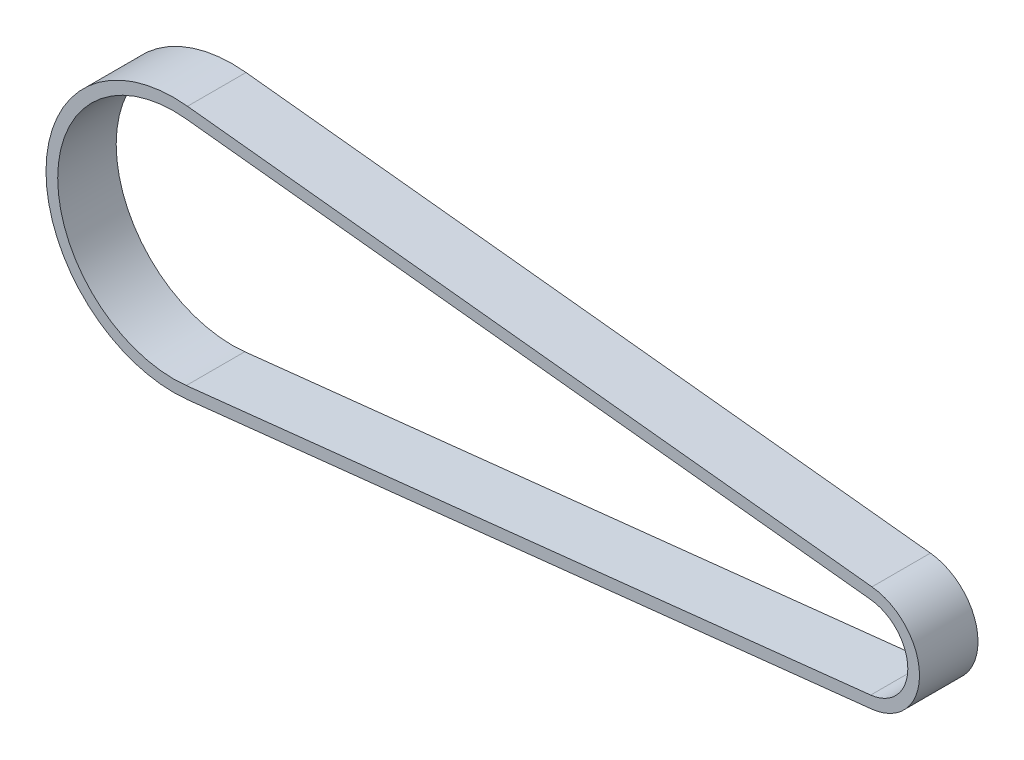
ISO-10303-21;
HEADER;
FILE_DESCRIPTION(('STEP AP214'),'2;1');
FILE_NAME('part.step','',(''),(''),'','','');
FILE_SCHEMA(('AUTOMOTIVE_DESIGN { 1 0 10303 214 1 1 1 1 }'));
ENDSEC;
DATA;
#1=APPLICATION_CONTEXT('core data for automotive mechanical design processes');
#2=APPLICATION_PROTOCOL_DEFINITION('international standard','automotive_design',2000,#1);
#3=PRODUCT_CONTEXT('',#1,'mechanical');
#4=PRODUCT('Part','Part','',(#3));
#5=PRODUCT_RELATED_PRODUCT_CATEGORY('part','',(#4));
#6=PRODUCT_DEFINITION_FORMATION('','',#4);
#7=PRODUCT_DEFINITION_CONTEXT('part definition',#1,'design');
#8=PRODUCT_DEFINITION('design','',#6,#7);
#9=PRODUCT_DEFINITION_SHAPE('','',#8);
#10=(LENGTH_UNIT() NAMED_UNIT(*) SI_UNIT(.MILLI.,.METRE.));
#11=(NAMED_UNIT(*) PLANE_ANGLE_UNIT() SI_UNIT($,.RADIAN.));
#12=(NAMED_UNIT(*) SI_UNIT($,.STERADIAN.) SOLID_ANGLE_UNIT());
#13=UNCERTAINTY_MEASURE_WITH_UNIT(LENGTH_MEASURE(1.E-05),#10,'distance_accuracy_value','');
#14=(GEOMETRIC_REPRESENTATION_CONTEXT(3) GLOBAL_UNCERTAINTY_ASSIGNED_CONTEXT((#13)) GLOBAL_UNIT_ASSIGNED_CONTEXT((#10,
#11,#12)) REPRESENTATION_CONTEXT('',''));
#15=CARTESIAN_POINT('',(0.,0.,0.));
#16=DIRECTION('',(0.,0.,1.));
#17=DIRECTION('',(1.,0.,0.));
#18=AXIS2_PLACEMENT_3D('',#15,#16,#17);
#19=CARTESIAN_POINT('',(-1.67310609811011E-10,1.49880108324396E-12,5.));
#20=DIRECTION('',(0.,0.,-1.));
#21=DIRECTION('',(-1.,0.,0.));
#22=AXIS2_PLACEMENT_3D('',#19,#20,#21);
#23=PLANE('',#22);
#24=CARTESIAN_POINT('',(-1.67310609811011E-10,1.49880108324396E-12,5.));
#25=DIRECTION('',(0.,0.,-1.));
#26=DIRECTION('',(-1.,0.,0.));
#27=AXIS2_PLACEMENT_3D('',#24,#25,#26);
#28=CIRCLE('',#27,21.845);
#29=CARTESIAN_POINT('',(2.34740623922351,21.7185107442323,5.));
#30=VERTEX_POINT('',#29);
#31=CARTESIAN_POINT('',(2.35257779655933,-21.7179511628119,5.));
#32=VERTEX_POINT('',#31);
#33=EDGE_CURVE('E162',#30,#32,#28,.F.);
#34=ORIENTED_EDGE('',*,*,#33,.T.);
#35=DIRECTION('',(0.99418407703426,0.107694108341802,0.));
#36=VECTOR('',#35,1.);
#37=CARTESIAN_POINT('',(2.35257779655936,-21.7179511628119,5.));
#38=LINE('',#37,#36);
#39=CARTESIAN_POINT('',(119.362802251218,-9.04292238231745,5.));
#40=VERTEX_POINT('',#39);
#41=EDGE_CURVE('E165',#32,#40,#38,.T.);
#42=ORIENTED_EDGE('',*,*,#41,.T.);
#43=CARTESIAN_POINT('',(118.381708924224,0.0140945594646613,5.));
#44=DIRECTION('',(0.,0.,-1.));
#45=DIRECTION('',(-1.,0.,0.));
#46=AXIS2_PLACEMENT_3D('',#43,#44,#45);
#47=CIRCLE('',#46,9.11);
#48=CARTESIAN_POINT('',(119.36064556148,9.07134486296398,5.));
#49=VERTEX_POINT('',#48);
#50=EDGE_CURVE('E168',#40,#49,#47,.F.);
#51=ORIENTED_EDGE('',*,*,#50,.T.);
#52=DIRECTION('',(-0.994209693029563,0.107457369621919,0.));
#53=VECTOR('',#52,1.);
#54=CARTESIAN_POINT('',(2.34740623922351,21.7185107442323,5.));
#55=LINE('',#54,#53);
#56=EDGE_CURVE('E170',#49,#30,#55,.T.);
#57=ORIENTED_EDGE('',*,*,#56,.T.);
#58=EDGE_LOOP('',(#34,#42,#51,#57));
#59=FACE_BOUND('',#58,.T.);
#60=CARTESIAN_POINT('',(-1.67310609811011E-10,1.49880108324396E-12,5.));
#61=DIRECTION('',(0.,0.,1.));
#62=DIRECTION('',(-1.,0.,0.));
#63=AXIS2_PLACEMENT_3D('',#60,#61,#62);
#64=CIRCLE('',#63,19.845);
#65=CARTESIAN_POINT('',(2.13249149997967,19.7300913581732,5.));
#66=VERTEX_POINT('',#65);
#67=CARTESIAN_POINT('',(2.13718957987576,-19.7295830087434,5.));
#68=VERTEX_POINT('',#67);
#69=EDGE_CURVE('E126',#66,#68,#64,.T.);
#70=ORIENTED_EDGE('',*,*,#69,.F.);
#71=DIRECTION('',(-0.994209693029563,0.107457369621919,0.));
#72=VECTOR('',#71,1.);
#73=CARTESIAN_POINT('',(2.13249149997967,19.7300913581732,5.));
#74=LINE('',#73,#72);
#75=CARTESIAN_POINT('',(119.145730822236,7.08292547690485,5.));
#76=VERTEX_POINT('',#75);
#77=EDGE_CURVE('E148',#76,#66,#74,.T.);
#78=ORIENTED_EDGE('',*,*,#77,.F.);
#79=CARTESIAN_POINT('',(118.381708924224,0.0140945594646613,5.));
#80=DIRECTION('',(0.,0.,1.));
#81=DIRECTION('',(-1.,0.,0.));
#82=AXIS2_PLACEMENT_3D('',#79,#80,#81);
#83=CIRCLE('',#82,7.11);
#84=CARTESIAN_POINT('',(119.147414034534,-7.05455422824893,5.));
#85=VERTEX_POINT('',#84);
#86=EDGE_CURVE('E146',#85,#76,#83,.T.);
#87=ORIENTED_EDGE('',*,*,#86,.F.);
#88=DIRECTION('',(0.99418407703426,0.107694108341802,0.));
#89=VECTOR('',#88,1.);
#90=CARTESIAN_POINT('',(119.147414034534,-7.05455422824893,5.));
#91=LINE('',#90,#89);
#92=EDGE_CURVE('E134',#68,#85,#91,.T.);
#93=ORIENTED_EDGE('',*,*,#92,.F.);
#94=EDGE_LOOP('',(#70,#78,#87,#93));
#95=FACE_BOUND('',#94,.T.);
#96=ADVANCED_FACE('F61',(#59,#95),#23,.F.);
#97=CARTESIAN_POINT('',(-1.67310609811011E-10,1.49880108324396E-12,-5.));
#98=DIRECTION('',(0.,0.,-1.));
#99=DIRECTION('',(-1.,0.,0.));
#100=AXIS2_PLACEMENT_3D('',#97,#98,#99);
#101=PLANE('',#100);
#102=CARTESIAN_POINT('',(-1.67310609811011E-10,1.49880108324396E-12,-5.));
#103=DIRECTION('',(0.,0.,-1.));
#104=DIRECTION('',(-1.,0.,0.));
#105=AXIS2_PLACEMENT_3D('',#102,#103,#104);
#106=CIRCLE('',#105,21.845);
#107=CARTESIAN_POINT('',(2.34740623922351,21.7185107442323,-5.));
#108=VERTEX_POINT('',#107);
#109=CARTESIAN_POINT('',(2.35257779655933,-21.7179511628119,-5.));
#110=VERTEX_POINT('',#109);
#111=EDGE_CURVE('E142',#108,#110,#106,.F.);
#112=ORIENTED_EDGE('',*,*,#111,.F.);
#113=DIRECTION('',(-0.994209693029563,0.107457369621919,0.));
#114=VECTOR('',#113,1.);
#115=CARTESIAN_POINT('',(2.34740623922351,21.7185107442323,-5.));
#116=LINE('',#115,#114);
#117=CARTESIAN_POINT('',(119.36064556148,9.07134486296398,-5.));
#118=VERTEX_POINT('',#117);
#119=EDGE_CURVE('E166',#118,#108,#116,.T.);
#120=ORIENTED_EDGE('',*,*,#119,.F.);
#121=CARTESIAN_POINT('',(118.381708924224,0.0140945594646613,-5.));
#122=DIRECTION('',(0.,0.,-1.));
#123=DIRECTION('',(-1.,0.,0.));
#124=AXIS2_PLACEMENT_3D('',#121,#122,#123);
#125=CIRCLE('',#124,9.11);
#126=CARTESIAN_POINT('',(119.362802251218,-9.04292238231745,-5.));
#127=VERTEX_POINT('',#126);
#128=EDGE_CURVE('E177',#127,#118,#125,.F.);
#129=ORIENTED_EDGE('',*,*,#128,.F.);
#130=DIRECTION('',(0.99418407703426,0.107694108341802,0.));
#131=VECTOR('',#130,1.);
#132=CARTESIAN_POINT('',(2.35257779655936,-21.7179511628119,-5.));
#133=LINE('',#132,#131);
#134=EDGE_CURVE('E175',#110,#127,#133,.T.);
#135=ORIENTED_EDGE('',*,*,#134,.F.);
#136=EDGE_LOOP('',(#112,#120,#129,#135));
#137=FACE_BOUND('',#136,.T.);
#138=DIRECTION('',(-0.994209693029563,0.107457369621919,0.));
#139=VECTOR('',#138,1.);
#140=CARTESIAN_POINT('',(2.13249149997967,19.7300913581732,-5.));
#141=LINE('',#140,#139);
#142=CARTESIAN_POINT('',(119.145730822236,7.08292547690485,-5.));
#143=VERTEX_POINT('',#142);
#144=CARTESIAN_POINT('',(2.13249149997967,19.7300913581732,-5.));
#145=VERTEX_POINT('',#144);
#146=EDGE_CURVE('E135',#143,#145,#141,.T.);
#147=ORIENTED_EDGE('',*,*,#146,.T.);
#148=CARTESIAN_POINT('',(-1.67310609811011E-10,1.49880108324396E-12,-5.));
#149=DIRECTION('',(0.,0.,1.));
#150=DIRECTION('',(-1.,0.,0.));
#151=AXIS2_PLACEMENT_3D('',#148,#149,#150);
#152=CIRCLE('',#151,19.845);
#153=CARTESIAN_POINT('',(2.13718957987576,-19.7295830087434,-5.));
#154=VERTEX_POINT('',#153);
#155=EDGE_CURVE('E84',#145,#154,#152,.T.);
#156=ORIENTED_EDGE('',*,*,#155,.T.);
#157=DIRECTION('',(0.99418407703426,0.107694108341802,0.));
#158=VECTOR('',#157,1.);
#159=CARTESIAN_POINT('',(119.147414034534,-7.05455422824893,-5.));
#160=LINE('',#159,#158);
#161=CARTESIAN_POINT('',(119.147414034534,-7.05455422824893,-5.));
#162=VERTEX_POINT('',#161);
#163=EDGE_CURVE('E141',#154,#162,#160,.T.);
#164=ORIENTED_EDGE('',*,*,#163,.T.);
#165=CARTESIAN_POINT('',(118.381708924224,0.0140945594646613,-5.));
#166=DIRECTION('',(0.,0.,1.));
#167=DIRECTION('',(-1.,0.,0.));
#168=AXIS2_PLACEMENT_3D('',#165,#166,#167);
#169=CIRCLE('',#168,7.11);
#170=EDGE_CURVE('E154',#162,#143,#169,.T.);
#171=ORIENTED_EDGE('',*,*,#170,.T.);
#172=EDGE_LOOP('',(#147,#156,#164,#171));
#173=FACE_BOUND('',#172,.T.);
#174=ADVANCED_FACE('F195',(#137,#173),#101,.T.);
#175=CARTESIAN_POINT('',(-1.67310609811011E-10,1.49880108324396E-12,5.));
#176=DIRECTION('',(0.,0.,-1.));
#177=DIRECTION('',(-1.,0.,0.));
#178=AXIS2_PLACEMENT_3D('',#175,#176,#177);
#179=CYLINDRICAL_SURFACE('',#178,21.845);
#180=ORIENTED_EDGE('',*,*,#111,.T.);
#181=DIRECTION('',(0.,0.,-1.));
#182=VECTOR('',#181,1.);
#183=CARTESIAN_POINT('',(2.35257779655933,-21.7179511628119,5.));
#184=LINE('',#183,#182);
#185=EDGE_CURVE('E12',#32,#110,#184,.T.);
#186=ORIENTED_EDGE('',*,*,#185,.F.);
#187=ORIENTED_EDGE('',*,*,#33,.F.);
#188=DIRECTION('',(0.,0.,-1.));
#189=VECTOR('',#188,1.);
#190=CARTESIAN_POINT('',(2.34740623922351,21.7185107442323,5.));
#191=LINE('',#190,#189);
#192=EDGE_CURVE('E172',#30,#108,#191,.T.);
#193=ORIENTED_EDGE('',*,*,#192,.T.);
#194=EDGE_LOOP('',(#180,#186,#187,#193));
#195=FACE_BOUND('',#194,.T.);
#196=ADVANCED_FACE('F63',(#195),#179,.T.);
#197=CARTESIAN_POINT('',(2.35257779655936,-21.7179511628119,5.));
#198=DIRECTION('',(-0.107694108341802,0.99418407703426,0.));
#199=DIRECTION('',(-0.99418407703426,-0.107694108341802,0.));
#200=AXIS2_PLACEMENT_3D('',#197,#198,#199);
#201=PLANE('',#200);
#202=ORIENTED_EDGE('',*,*,#134,.T.);
#203=DIRECTION('',(0.,0.,-1.));
#204=VECTOR('',#203,1.);
#205=CARTESIAN_POINT('',(119.362802251218,-9.04292238231745,5.));
#206=LINE('',#205,#204);
#207=EDGE_CURVE('E69',#40,#127,#206,.T.);
#208=ORIENTED_EDGE('',*,*,#207,.F.);
#209=ORIENTED_EDGE('',*,*,#41,.F.);
#210=ORIENTED_EDGE('',*,*,#185,.T.);
#211=EDGE_LOOP('',(#202,#208,#209,#210));
#212=FACE_BOUND('',#211,.T.);
#213=ADVANCED_FACE('F205',(#212),#201,.F.);
#214=CARTESIAN_POINT('',(118.381708924224,0.0140945594646613,5.));
#215=DIRECTION('',(0.,0.,-1.));
#216=DIRECTION('',(-1.,0.,0.));
#217=AXIS2_PLACEMENT_3D('',#214,#215,#216);
#218=CYLINDRICAL_SURFACE('',#217,9.11);
#219=ORIENTED_EDGE('',*,*,#128,.T.);
#220=DIRECTION('',(0.,0.,-1.));
#221=VECTOR('',#220,1.);
#222=CARTESIAN_POINT('',(119.36064556148,9.07134486296398,5.));
#223=LINE('',#222,#221);
#224=EDGE_CURVE('E182',#49,#118,#223,.T.);
#225=ORIENTED_EDGE('',*,*,#224,.F.);
#226=ORIENTED_EDGE('',*,*,#50,.F.);
#227=ORIENTED_EDGE('',*,*,#207,.T.);
#228=EDGE_LOOP('',(#219,#225,#226,#227));
#229=FACE_BOUND('',#228,.T.);
#230=ADVANCED_FACE('F189',(#229),#218,.T.);
#231=CARTESIAN_POINT('',(2.34740623922351,21.7185107442323,5.));
#232=DIRECTION('',(-0.107457369621919,-0.994209693029563,0.));
#233=DIRECTION('',(0.994209693029563,-0.107457369621919,0.));
#234=AXIS2_PLACEMENT_3D('',#231,#232,#233);
#235=PLANE('',#234);
#236=ORIENTED_EDGE('',*,*,#119,.T.);
#237=ORIENTED_EDGE('',*,*,#192,.F.);
#238=ORIENTED_EDGE('',*,*,#56,.F.);
#239=ORIENTED_EDGE('',*,*,#224,.T.);
#240=EDGE_LOOP('',(#236,#237,#238,#239));
#241=FACE_BOUND('',#240,.T.);
#242=ADVANCED_FACE('F199',(#241),#235,.F.);
#243=CARTESIAN_POINT('',(-1.67310609811011E-10,1.49880108324396E-12,5.));
#244=DIRECTION('',(0.,0.,-1.));
#245=DIRECTION('',(-1.,0.,0.));
#246=AXIS2_PLACEMENT_3D('',#243,#244,#245);
#247=CYLINDRICAL_SURFACE('',#246,19.845);
#248=ORIENTED_EDGE('',*,*,#155,.F.);
#249=DIRECTION('',(0.,0.,-1.));
#250=VECTOR('',#249,1.);
#251=CARTESIAN_POINT('',(2.13249149997967,19.7300913581732,5.));
#252=LINE('',#251,#250);
#253=EDGE_CURVE('E130',#66,#145,#252,.T.);
#254=ORIENTED_EDGE('',*,*,#253,.F.);
#255=ORIENTED_EDGE('',*,*,#69,.T.);
#256=DIRECTION('',(0.,0.,-1.));
#257=VECTOR('',#256,1.);
#258=CARTESIAN_POINT('',(2.13718957987576,-19.7295830087434,5.));
#259=LINE('',#258,#257);
#260=EDGE_CURVE('E129',#68,#154,#259,.T.);
#261=ORIENTED_EDGE('',*,*,#260,.T.);
#262=EDGE_LOOP('',(#248,#254,#255,#261));
#263=FACE_BOUND('',#262,.T.);
#264=ADVANCED_FACE('F128',(#263),#247,.F.);
#265=CARTESIAN_POINT('',(119.147414034534,-7.05455422824893,5.));
#266=DIRECTION('',(-0.107694108341802,0.99418407703426,0.));
#267=DIRECTION('',(-0.99418407703426,-0.107694108341802,0.));
#268=AXIS2_PLACEMENT_3D('',#265,#266,#267);
#269=PLANE('',#268);
#270=ORIENTED_EDGE('',*,*,#163,.F.);
#271=ORIENTED_EDGE('',*,*,#260,.F.);
#272=ORIENTED_EDGE('',*,*,#92,.T.);
#273=DIRECTION('',(0.,0.,-1.));
#274=VECTOR('',#273,1.);
#275=CARTESIAN_POINT('',(119.147414034534,-7.05455422824893,5.));
#276=LINE('',#275,#274);
#277=EDGE_CURVE('E143',#85,#162,#276,.T.);
#278=ORIENTED_EDGE('',*,*,#277,.T.);
#279=EDGE_LOOP('',(#270,#271,#272,#278));
#280=FACE_BOUND('',#279,.T.);
#281=ADVANCED_FACE('F138',(#280),#269,.T.);
#282=CARTESIAN_POINT('',(118.381708924224,0.0140945594646613,5.));
#283=DIRECTION('',(0.,0.,-1.));
#284=DIRECTION('',(-1.,0.,0.));
#285=AXIS2_PLACEMENT_3D('',#282,#283,#284);
#286=CYLINDRICAL_SURFACE('',#285,7.11);
#287=ORIENTED_EDGE('',*,*,#170,.F.);
#288=ORIENTED_EDGE('',*,*,#277,.F.);
#289=ORIENTED_EDGE('',*,*,#86,.T.);
#290=DIRECTION('',(0.,0.,-1.));
#291=VECTOR('',#290,1.);
#292=CARTESIAN_POINT('',(119.145730822236,7.08292547690485,5.));
#293=LINE('',#292,#291);
#294=EDGE_CURVE('E76',#76,#143,#293,.T.);
#295=ORIENTED_EDGE('',*,*,#294,.T.);
#296=EDGE_LOOP('',(#287,#288,#289,#295));
#297=FACE_BOUND('',#296,.T.);
#298=ADVANCED_FACE('F228',(#297),#286,.F.);
#299=CARTESIAN_POINT('',(2.13249149997967,19.7300913581732,5.));
#300=DIRECTION('',(-0.107457369621919,-0.994209693029563,0.));
#301=DIRECTION('',(0.994209693029563,-0.107457369621919,0.));
#302=AXIS2_PLACEMENT_3D('',#299,#300,#301);
#303=PLANE('',#302);
#304=ORIENTED_EDGE('',*,*,#146,.F.);
#305=ORIENTED_EDGE('',*,*,#294,.F.);
#306=ORIENTED_EDGE('',*,*,#77,.T.);
#307=ORIENTED_EDGE('',*,*,#253,.T.);
#308=EDGE_LOOP('',(#304,#305,#306,#307));
#309=FACE_BOUND('',#308,.T.);
#310=ADVANCED_FACE('F232',(#309),#303,.T.);
#311=CLOSED_SHELL('',(#96,#174,#196,#213,#230,#242,#264,#281,#298,#310));
#312=MANIFOLD_SOLID_BREP('B2',#311);
#313=ADVANCED_BREP_SHAPE_REPRESENTATION('',(#18,#312),#14);
#314=SHAPE_DEFINITION_REPRESENTATION(#9,#313);
ENDSEC;
END-ISO-10303-21;
